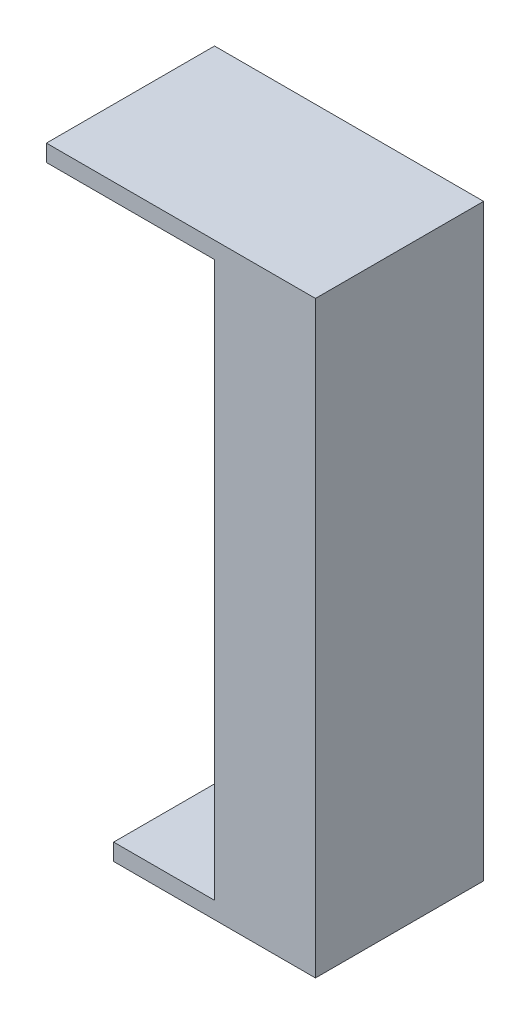
ISO-10303-21;
HEADER;
FILE_DESCRIPTION(('STEP AP214'),'2;1');
FILE_NAME('part.step','',(''),(''),'','','');
FILE_SCHEMA(('AUTOMOTIVE_DESIGN { 1 0 10303 214 1 1 1 1 }'));
ENDSEC;
DATA;
#1=APPLICATION_CONTEXT('core data for automotive mechanical design processes');
#2=APPLICATION_PROTOCOL_DEFINITION('international standard','automotive_design',2000,#1);
#3=PRODUCT_CONTEXT('',#1,'mechanical');
#4=PRODUCT('Part','Part','',(#3));
#5=PRODUCT_RELATED_PRODUCT_CATEGORY('part','',(#4));
#6=PRODUCT_DEFINITION_FORMATION('','',#4);
#7=PRODUCT_DEFINITION_CONTEXT('part definition',#1,'design');
#8=PRODUCT_DEFINITION('design','',#6,#7);
#9=PRODUCT_DEFINITION_SHAPE('','',#8);
#10=(LENGTH_UNIT() NAMED_UNIT(*) SI_UNIT(.MILLI.,.METRE.));
#11=(NAMED_UNIT(*) PLANE_ANGLE_UNIT() SI_UNIT($,.RADIAN.));
#12=(NAMED_UNIT(*) SI_UNIT($,.STERADIAN.) SOLID_ANGLE_UNIT());
#13=UNCERTAINTY_MEASURE_WITH_UNIT(LENGTH_MEASURE(1.E-05),#10,'distance_accuracy_value','');
#14=(GEOMETRIC_REPRESENTATION_CONTEXT(3) GLOBAL_UNCERTAINTY_ASSIGNED_CONTEXT((#13)) GLOBAL_UNIT_ASSIGNED_CONTEXT((#10,
#11,#12)) REPRESENTATION_CONTEXT('',''));
#15=CARTESIAN_POINT('',(0.,0.,0.));
#16=DIRECTION('',(0.,0.,1.));
#17=DIRECTION('',(1.,0.,0.));
#18=AXIS2_PLACEMENT_3D('',#15,#16,#17);
#19=CARTESIAN_POINT('',(55.,87.5,25.));
#20=DIRECTION('',(0.,-1.,0.));
#21=DIRECTION('',(0.,0.,-1.));
#22=AXIS2_PLACEMENT_3D('',#19,#20,#21);
#23=PLANE('',#22);
#24=DIRECTION('',(-1.,0.,0.));
#25=VECTOR('',#24,1.);
#26=CARTESIAN_POINT('',(55.,87.5,-25.));
#27=LINE('',#26,#25);
#28=CARTESIAN_POINT('',(55.,87.5,-25.));
#29=VERTEX_POINT('',#28);
#30=CARTESIAN_POINT('',(-25.,87.5,-25.));
#31=VERTEX_POINT('',#30);
#32=EDGE_CURVE('E129',#29,#31,#27,.T.);
#33=ORIENTED_EDGE('',*,*,#32,.T.);
#34=DIRECTION('',(0.,0.,-1.));
#35=VECTOR('',#34,1.);
#36=CARTESIAN_POINT('',(-25.,87.5,25.));
#37=LINE('',#36,#35);
#38=CARTESIAN_POINT('',(-25.,87.5,25.));
#39=VERTEX_POINT('',#38);
#40=EDGE_CURVE('E11',#39,#31,#37,.T.);
#41=ORIENTED_EDGE('',*,*,#40,.F.);
#42=DIRECTION('',(-1.,0.,0.));
#43=VECTOR('',#42,1.);
#44=CARTESIAN_POINT('',(55.,87.5,25.));
#45=LINE('',#44,#43);
#46=CARTESIAN_POINT('',(55.,87.5,25.));
#47=VERTEX_POINT('',#46);
#48=EDGE_CURVE('E143',#47,#39,#45,.T.);
#49=ORIENTED_EDGE('',*,*,#48,.F.);
#50=DIRECTION('',(0.,0.,-1.));
#51=VECTOR('',#50,1.);
#52=CARTESIAN_POINT('',(55.,87.5,25.));
#53=LINE('',#52,#51);
#54=EDGE_CURVE('E125',#47,#29,#53,.T.);
#55=ORIENTED_EDGE('',*,*,#54,.T.);
#56=EDGE_LOOP('',(#33,#41,#49,#55));
#57=FACE_BOUND('',#56,.T.);
#58=ADVANCED_FACE('F33',(#57),#23,.F.);
#59=CARTESIAN_POINT('',(-25.,87.5,25.));
#60=DIRECTION('',(1.,0.,0.));
#61=DIRECTION('',(0.,1.,0.));
#62=AXIS2_PLACEMENT_3D('',#59,#60,#61);
#63=PLANE('',#62);
#64=DIRECTION('',(0.,-1.,0.));
#65=VECTOR('',#64,1.);
#66=CARTESIAN_POINT('',(-25.,87.5,-25.));
#67=LINE('',#66,#65);
#68=CARTESIAN_POINT('',(-25.,82.5,-25.));
#69=VERTEX_POINT('',#68);
#70=EDGE_CURVE('E132',#31,#69,#67,.T.);
#71=ORIENTED_EDGE('',*,*,#70,.T.);
#72=DIRECTION('',(0.,0.,-1.));
#73=VECTOR('',#72,1.);
#74=CARTESIAN_POINT('',(-25.,82.5,25.));
#75=LINE('',#74,#73);
#76=CARTESIAN_POINT('',(-25.,82.5,25.));
#77=VERTEX_POINT('',#76);
#78=EDGE_CURVE('E41',#77,#69,#75,.T.);
#79=ORIENTED_EDGE('',*,*,#78,.F.);
#80=DIRECTION('',(0.,-1.,0.));
#81=VECTOR('',#80,1.);
#82=CARTESIAN_POINT('',(-25.,87.5,25.));
#83=LINE('',#82,#81);
#84=EDGE_CURVE('E92',#39,#77,#83,.T.);
#85=ORIENTED_EDGE('',*,*,#84,.F.);
#86=ORIENTED_EDGE('',*,*,#40,.T.);
#87=EDGE_LOOP('',(#71,#79,#85,#86));
#88=FACE_BOUND('',#87,.T.);
#89=ADVANCED_FACE('F178',(#88),#63,.F.);
#90=CARTESIAN_POINT('',(-25.,82.5,25.));
#91=DIRECTION('',(0.,1.,0.));
#92=DIRECTION('',(0.,0.,1.));
#93=AXIS2_PLACEMENT_3D('',#90,#91,#92);
#94=PLANE('',#93);
#95=DIRECTION('',(1.,0.,0.));
#96=VECTOR('',#95,1.);
#97=CARTESIAN_POINT('',(-25.,82.5,-25.));
#98=LINE('',#97,#96);
#99=CARTESIAN_POINT('',(25.,82.5,-25.));
#100=VERTEX_POINT('',#99);
#101=EDGE_CURVE('E134',#69,#100,#98,.T.);
#102=ORIENTED_EDGE('',*,*,#101,.T.);
#103=DIRECTION('',(0.,0.,-1.));
#104=VECTOR('',#103,1.);
#105=CARTESIAN_POINT('',(25.,82.5,25.));
#106=LINE('',#105,#104);
#107=CARTESIAN_POINT('',(25.,82.5,25.));
#108=VERTEX_POINT('',#107);
#109=EDGE_CURVE('E150',#108,#100,#106,.T.);
#110=ORIENTED_EDGE('',*,*,#109,.F.);
#111=DIRECTION('',(1.,0.,0.));
#112=VECTOR('',#111,1.);
#113=CARTESIAN_POINT('',(-25.,82.5,25.));
#114=LINE('',#113,#112);
#115=EDGE_CURVE('E158',#77,#108,#114,.T.);
#116=ORIENTED_EDGE('',*,*,#115,.F.);
#117=ORIENTED_EDGE('',*,*,#78,.T.);
#118=EDGE_LOOP('',(#102,#110,#116,#117));
#119=FACE_BOUND('',#118,.T.);
#120=ADVANCED_FACE('F156',(#119),#94,.F.);
#121=CARTESIAN_POINT('',(25.,82.5,25.));
#122=DIRECTION('',(1.,0.,0.));
#123=DIRECTION('',(0.,1.,0.));
#124=AXIS2_PLACEMENT_3D('',#121,#122,#123);
#125=PLANE('',#124);
#126=DIRECTION('',(0.,-1.,0.));
#127=VECTOR('',#126,1.);
#128=CARTESIAN_POINT('',(25.,82.5,-25.));
#129=LINE('',#128,#127);
#130=CARTESIAN_POINT('',(25.,-82.5,-25.));
#131=VERTEX_POINT('',#130);
#132=EDGE_CURVE('E136',#100,#131,#129,.T.);
#133=ORIENTED_EDGE('',*,*,#132,.T.);
#134=DIRECTION('',(0.,0.,-1.));
#135=VECTOR('',#134,1.);
#136=CARTESIAN_POINT('',(25.,-82.5,25.));
#137=LINE('',#136,#135);
#138=CARTESIAN_POINT('',(25.,-82.5,25.));
#139=VERTEX_POINT('',#138);
#140=EDGE_CURVE('E147',#139,#131,#137,.T.);
#141=ORIENTED_EDGE('',*,*,#140,.F.);
#142=DIRECTION('',(0.,-1.,0.));
#143=VECTOR('',#142,1.);
#144=CARTESIAN_POINT('',(25.,82.5,25.));
#145=LINE('',#144,#143);
#146=EDGE_CURVE('E170',#108,#139,#145,.T.);
#147=ORIENTED_EDGE('',*,*,#146,.F.);
#148=ORIENTED_EDGE('',*,*,#109,.T.);
#149=EDGE_LOOP('',(#133,#141,#147,#148));
#150=FACE_BOUND('',#149,.T.);
#151=ADVANCED_FACE('F166',(#150),#125,.F.);
#152=CARTESIAN_POINT('',(25.,-82.5,25.));
#153=DIRECTION('',(0.,-1.,0.));
#154=DIRECTION('',(1.,0.,0.));
#155=AXIS2_PLACEMENT_3D('',#152,#153,#154);
#156=PLANE('',#155);
#157=DIRECTION('',(-1.,0.,0.));
#158=VECTOR('',#157,1.);
#159=CARTESIAN_POINT('',(25.,-82.5,-25.));
#160=LINE('',#159,#158);
#161=CARTESIAN_POINT('',(-5.,-82.5,-25.));
#162=VERTEX_POINT('',#161);
#163=EDGE_CURVE('E138',#131,#162,#160,.T.);
#164=ORIENTED_EDGE('',*,*,#163,.T.);
#165=DIRECTION('',(0.,0.,-1.));
#166=VECTOR('',#165,1.);
#167=CARTESIAN_POINT('',(-5.,-82.5,25.));
#168=LINE('',#167,#166);
#169=CARTESIAN_POINT('',(-5.,-82.5,25.));
#170=VERTEX_POINT('',#169);
#171=EDGE_CURVE('E120',#170,#162,#168,.T.);
#172=ORIENTED_EDGE('',*,*,#171,.F.);
#173=DIRECTION('',(-1.,0.,0.));
#174=VECTOR('',#173,1.);
#175=CARTESIAN_POINT('',(25.,-82.5,25.));
#176=LINE('',#175,#174);
#177=EDGE_CURVE('E111',#139,#170,#176,.T.);
#178=ORIENTED_EDGE('',*,*,#177,.F.);
#179=ORIENTED_EDGE('',*,*,#140,.T.);
#180=EDGE_LOOP('',(#164,#172,#178,#179));
#181=FACE_BOUND('',#180,.T.);
#182=ADVANCED_FACE('F169',(#181),#156,.F.);
#183=CARTESIAN_POINT('',(-5.,-82.5,25.));
#184=DIRECTION('',(1.,0.,0.));
#185=DIRECTION('',(0.,1.,0.));
#186=AXIS2_PLACEMENT_3D('',#183,#184,#185);
#187=PLANE('',#186);
#188=DIRECTION('',(0.,-1.,0.));
#189=VECTOR('',#188,1.);
#190=CARTESIAN_POINT('',(-5.,-82.5,-25.));
#191=LINE('',#190,#189);
#192=CARTESIAN_POINT('',(-5.,-87.5,-25.));
#193=VERTEX_POINT('',#192);
#194=EDGE_CURVE('E119',#162,#193,#191,.T.);
#195=ORIENTED_EDGE('',*,*,#194,.T.);
#196=DIRECTION('',(0.,0.,-1.));
#197=VECTOR('',#196,1.);
#198=CARTESIAN_POINT('',(-5.,-87.5,25.));
#199=LINE('',#198,#197);
#200=CARTESIAN_POINT('',(-5.,-87.5,25.));
#201=VERTEX_POINT('',#200);
#202=EDGE_CURVE('E116',#201,#193,#199,.T.);
#203=ORIENTED_EDGE('',*,*,#202,.F.);
#204=DIRECTION('',(0.,-1.,0.));
#205=VECTOR('',#204,1.);
#206=CARTESIAN_POINT('',(-5.,-82.5,25.));
#207=LINE('',#206,#205);
#208=EDGE_CURVE('E105',#170,#201,#207,.T.);
#209=ORIENTED_EDGE('',*,*,#208,.F.);
#210=ORIENTED_EDGE('',*,*,#171,.T.);
#211=EDGE_LOOP('',(#195,#203,#209,#210));
#212=FACE_BOUND('',#211,.T.);
#213=ADVANCED_FACE('F117',(#212),#187,.F.);
#214=CARTESIAN_POINT('',(-5.,-87.5,25.));
#215=DIRECTION('',(0.,1.,0.));
#216=DIRECTION('',(0.,0.,1.));
#217=AXIS2_PLACEMENT_3D('',#214,#215,#216);
#218=PLANE('',#217);
#219=DIRECTION('',(1.,0.,0.));
#220=VECTOR('',#219,1.);
#221=CARTESIAN_POINT('',(-5.,-87.5,-25.));
#222=LINE('',#221,#220);
#223=CARTESIAN_POINT('',(55.,-87.5,-25.));
#224=VERTEX_POINT('',#223);
#225=EDGE_CURVE('E78',#193,#224,#222,.T.);
#226=ORIENTED_EDGE('',*,*,#225,.T.);
#227=DIRECTION('',(0.,0.,-1.));
#228=VECTOR('',#227,1.);
#229=CARTESIAN_POINT('',(55.,-87.5,25.));
#230=LINE('',#229,#228);
#231=CARTESIAN_POINT('',(55.,-87.5,25.));
#232=VERTEX_POINT('',#231);
#233=EDGE_CURVE('E121',#232,#224,#230,.T.);
#234=ORIENTED_EDGE('',*,*,#233,.F.);
#235=DIRECTION('',(1.,0.,0.));
#236=VECTOR('',#235,1.);
#237=CARTESIAN_POINT('',(-5.,-87.5,25.));
#238=LINE('',#237,#236);
#239=EDGE_CURVE('E109',#201,#232,#238,.T.);
#240=ORIENTED_EDGE('',*,*,#239,.F.);
#241=ORIENTED_EDGE('',*,*,#202,.T.);
#242=EDGE_LOOP('',(#226,#234,#240,#241));
#243=FACE_BOUND('',#242,.T.);
#244=ADVANCED_FACE('F123',(#243),#218,.F.);
#245=CARTESIAN_POINT('',(55.,-87.5,25.));
#246=DIRECTION('',(-1.,0.,0.));
#247=DIRECTION('',(0.,0.,1.));
#248=AXIS2_PLACEMENT_3D('',#245,#246,#247);
#249=PLANE('',#248);
#250=DIRECTION('',(0.,1.,0.));
#251=VECTOR('',#250,1.);
#252=CARTESIAN_POINT('',(55.,-87.5,-25.));
#253=LINE('',#252,#251);
#254=EDGE_CURVE('E84',#224,#29,#253,.T.);
#255=ORIENTED_EDGE('',*,*,#254,.T.);
#256=ORIENTED_EDGE('',*,*,#54,.F.);
#257=DIRECTION('',(0.,1.,0.));
#258=VECTOR('',#257,1.);
#259=CARTESIAN_POINT('',(55.,-87.5,25.));
#260=LINE('',#259,#258);
#261=EDGE_CURVE('E49',#232,#47,#260,.T.);
#262=ORIENTED_EDGE('',*,*,#261,.F.);
#263=ORIENTED_EDGE('',*,*,#233,.T.);
#264=EDGE_LOOP('',(#255,#256,#262,#263));
#265=FACE_BOUND('',#264,.T.);
#266=ADVANCED_FACE('F194',(#265),#249,.F.);
#267=CARTESIAN_POINT('',(0.,0.,25.));
#268=DIRECTION('',(0.,0.,1.));
#269=DIRECTION('',(1.,0.,0.));
#270=AXIS2_PLACEMENT_3D('',#267,#268,#269);
#271=PLANE('',#270);
#272=ORIENTED_EDGE('',*,*,#48,.T.);
#273=ORIENTED_EDGE('',*,*,#84,.T.);
#274=ORIENTED_EDGE('',*,*,#115,.T.);
#275=ORIENTED_EDGE('',*,*,#146,.T.);
#276=ORIENTED_EDGE('',*,*,#177,.T.);
#277=ORIENTED_EDGE('',*,*,#208,.T.);
#278=ORIENTED_EDGE('',*,*,#239,.T.);
#279=ORIENTED_EDGE('',*,*,#261,.T.);
#280=EDGE_LOOP('',(#272,#273,#274,#275,#276,#277,#278,#279));
#281=FACE_BOUND('',#280,.T.);
#282=ADVANCED_FACE('F107',(#281),#271,.T.);
#283=CARTESIAN_POINT('',(0.,0.,-25.));
#284=DIRECTION('',(0.,0.,1.));
#285=DIRECTION('',(1.,0.,0.));
#286=AXIS2_PLACEMENT_3D('',#283,#284,#285);
#287=PLANE('',#286);
#288=ORIENTED_EDGE('',*,*,#32,.F.);
#289=ORIENTED_EDGE('',*,*,#254,.F.);
#290=ORIENTED_EDGE('',*,*,#225,.F.);
#291=ORIENTED_EDGE('',*,*,#194,.F.);
#292=ORIENTED_EDGE('',*,*,#163,.F.);
#293=ORIENTED_EDGE('',*,*,#132,.F.);
#294=ORIENTED_EDGE('',*,*,#101,.F.);
#295=ORIENTED_EDGE('',*,*,#70,.F.);
#296=EDGE_LOOP('',(#288,#289,#290,#291,#292,#293,#294,#295));
#297=FACE_BOUND('',#296,.T.);
#298=ADVANCED_FACE('F162',(#297),#287,.F.);
#299=CLOSED_SHELL('',(#58,#89,#120,#151,#182,#213,#244,#266,#282,#298));
#300=MANIFOLD_SOLID_BREP('B2',#299);
#301=ADVANCED_BREP_SHAPE_REPRESENTATION('',(#18,#300),#14);
#302=SHAPE_DEFINITION_REPRESENTATION(#9,#301);
ENDSEC;
END-ISO-10303-21;
